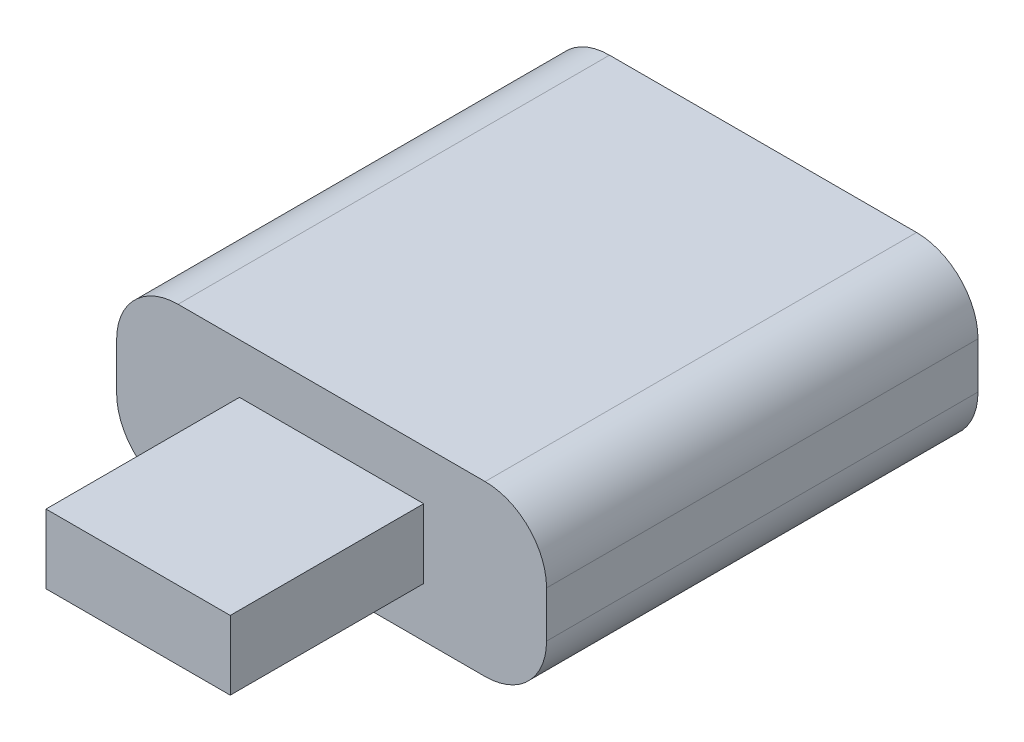
ISO-10303-21;
HEADER;
FILE_DESCRIPTION(('STEP AP214'),'2;1');
FILE_NAME('part.step','',(''),(''),'','','');
FILE_SCHEMA(('AUTOMOTIVE_DESIGN { 1 0 10303 214 1 1 1 1 }'));
ENDSEC;
DATA;
#1=APPLICATION_CONTEXT('core data for automotive mechanical design processes');
#2=APPLICATION_PROTOCOL_DEFINITION('international standard','automotive_design',2000,#1);
#3=PRODUCT_CONTEXT('',#1,'mechanical');
#4=PRODUCT('Part','Part','',(#3));
#5=PRODUCT_RELATED_PRODUCT_CATEGORY('part','',(#4));
#6=PRODUCT_DEFINITION_FORMATION('','',#4);
#7=PRODUCT_DEFINITION_CONTEXT('part definition',#1,'design');
#8=PRODUCT_DEFINITION('design','',#6,#7);
#9=PRODUCT_DEFINITION_SHAPE('','',#8);
#10=(LENGTH_UNIT() NAMED_UNIT(*) SI_UNIT(.MILLI.,.METRE.));
#11=(NAMED_UNIT(*) PLANE_ANGLE_UNIT() SI_UNIT($,.RADIAN.));
#12=(NAMED_UNIT(*) SI_UNIT($,.STERADIAN.) SOLID_ANGLE_UNIT());
#13=UNCERTAINTY_MEASURE_WITH_UNIT(LENGTH_MEASURE(1.E-05),#10,'distance_accuracy_value','');
#14=(GEOMETRIC_REPRESENTATION_CONTEXT(3) GLOBAL_UNCERTAINTY_ASSIGNED_CONTEXT((#13)) GLOBAL_UNIT_ASSIGNED_CONTEXT((#10,
#11,#12)) REPRESENTATION_CONTEXT('',''));
#15=CARTESIAN_POINT('',(0.,0.,0.));
#16=DIRECTION('',(0.,0.,1.));
#17=DIRECTION('',(1.,0.,0.));
#18=AXIS2_PLACEMENT_3D('',#15,#16,#17);
#19=CARTESIAN_POINT('',(0.,-5.5,14.05));
#20=DIRECTION('',(0.,0.,1.));
#21=DIRECTION('',(1.,0.,0.));
#22=AXIS2_PLACEMENT_3D('',#19,#20,#21);
#23=PLANE('',#22);
#24=DIRECTION('',(0.,1.,0.));
#25=VECTOR('',#24,1.);
#26=CARTESIAN_POINT('',(-14.,-5.5,14.05));
#27=LINE('',#26,#25);
#28=CARTESIAN_POINT('',(-14.,-1.5,14.05));
#29=VERTEX_POINT('',#28);
#30=CARTESIAN_POINT('',(-14.,1.5,14.05));
#31=VERTEX_POINT('',#30);
#32=EDGE_CURVE('E185',#29,#31,#27,.T.);
#33=ORIENTED_EDGE('',*,*,#32,.F.);
#34=CARTESIAN_POINT('',(-9.99999999999999,-1.5,14.05));
#35=DIRECTION('',(0.,0.,1.));
#36=DIRECTION('',(1.,0.,0.));
#37=AXIS2_PLACEMENT_3D('',#34,#35,#36);
#38=CIRCLE('',#37,4.);
#39=CARTESIAN_POINT('',(-9.99999999999999,-5.5,14.05));
#40=VERTEX_POINT('',#39);
#41=EDGE_CURVE('E202',#29,#40,#38,.T.);
#42=ORIENTED_EDGE('',*,*,#41,.T.);
#43=DIRECTION('',(1.,0.,0.));
#44=VECTOR('',#43,1.);
#45=CARTESIAN_POINT('',(0.,-5.5,14.05));
#46=LINE('',#45,#44);
#47=CARTESIAN_POINT('',(10.,-5.5,14.05));
#48=VERTEX_POINT('',#47);
#49=EDGE_CURVE('E177',#40,#48,#46,.T.);
#50=ORIENTED_EDGE('',*,*,#49,.T.);
#51=CARTESIAN_POINT('',(10.,-1.5,14.05));
#52=DIRECTION('',(0.,0.,1.));
#53=DIRECTION('',(1.,0.,0.));
#54=AXIS2_PLACEMENT_3D('',#51,#52,#53);
#55=CIRCLE('',#54,4.);
#56=CARTESIAN_POINT('',(14.,-1.5,14.05));
#57=VERTEX_POINT('',#56);
#58=EDGE_CURVE('E198',#48,#57,#55,.T.);
#59=ORIENTED_EDGE('',*,*,#58,.T.);
#60=DIRECTION('',(0.,1.,0.));
#61=VECTOR('',#60,1.);
#62=CARTESIAN_POINT('',(14.,-5.5,14.05));
#63=LINE('',#62,#61);
#64=CARTESIAN_POINT('',(14.,1.5,14.05));
#65=VERTEX_POINT('',#64);
#66=EDGE_CURVE('E181',#57,#65,#63,.T.);
#67=ORIENTED_EDGE('',*,*,#66,.T.);
#68=CARTESIAN_POINT('',(10.,1.5,14.05));
#69=DIRECTION('',(0.,0.,1.));
#70=DIRECTION('',(1.,0.,0.));
#71=AXIS2_PLACEMENT_3D('',#68,#69,#70);
#72=CIRCLE('',#71,4.);
#73=CARTESIAN_POINT('',(10.,5.5,14.05));
#74=VERTEX_POINT('',#73);
#75=EDGE_CURVE('E196',#65,#74,#72,.T.);
#76=ORIENTED_EDGE('',*,*,#75,.T.);
#77=DIRECTION('',(1.,0.,0.));
#78=VECTOR('',#77,1.);
#79=CARTESIAN_POINT('',(0.,5.5,14.05));
#80=LINE('',#79,#78);
#81=CARTESIAN_POINT('',(-9.99999999999999,5.5,14.05));
#82=VERTEX_POINT('',#81);
#83=EDGE_CURVE('E171',#82,#74,#80,.T.);
#84=ORIENTED_EDGE('',*,*,#83,.F.);
#85=CARTESIAN_POINT('',(-9.99999999999999,1.5,14.05));
#86=DIRECTION('',(0.,0.,1.));
#87=DIRECTION('',(1.,0.,0.));
#88=AXIS2_PLACEMENT_3D('',#85,#86,#87);
#89=CIRCLE('',#88,4.);
#90=EDGE_CURVE('E200',#82,#31,#89,.T.);
#91=ORIENTED_EDGE('',*,*,#90,.T.);
#92=EDGE_LOOP('',(#33,#42,#50,#59,#67,#76,#84,#91));
#93=FACE_BOUND('',#92,.T.);
#94=DIRECTION('',(1.,0.,0.));
#95=VECTOR('',#94,1.);
#96=CARTESIAN_POINT('',(0.,-2.25,14.05));
#97=LINE('',#96,#95);
#98=CARTESIAN_POINT('',(-6.,-2.25,14.05));
#99=VERTEX_POINT('',#98);
#100=CARTESIAN_POINT('',(6.,-2.25,14.05));
#101=VERTEX_POINT('',#100);
#102=EDGE_CURVE('E155',#99,#101,#97,.T.);
#103=ORIENTED_EDGE('',*,*,#102,.F.);
#104=DIRECTION('',(0.,1.,0.));
#105=VECTOR('',#104,1.);
#106=CARTESIAN_POINT('',(-6.,-2.25,14.05));
#107=LINE('',#106,#105);
#108=CARTESIAN_POINT('',(-6.,2.25,14.05));
#109=VERTEX_POINT('',#108);
#110=EDGE_CURVE('E141',#99,#109,#107,.T.);
#111=ORIENTED_EDGE('',*,*,#110,.T.);
#112=DIRECTION('',(1.,0.,0.));
#113=VECTOR('',#112,1.);
#114=CARTESIAN_POINT('',(0.,2.25,14.05));
#115=LINE('',#114,#113);
#116=CARTESIAN_POINT('',(6.,2.25,14.05));
#117=VERTEX_POINT('',#116);
#118=EDGE_CURVE('E149',#109,#117,#115,.T.);
#119=ORIENTED_EDGE('',*,*,#118,.T.);
#120=DIRECTION('',(0.,1.,0.));
#121=VECTOR('',#120,1.);
#122=CARTESIAN_POINT('',(6.,-2.25,14.05));
#123=LINE('',#122,#121);
#124=EDGE_CURVE('E164',#101,#117,#123,.T.);
#125=ORIENTED_EDGE('',*,*,#124,.F.);
#126=EDGE_LOOP('',(#103,#111,#119,#125));
#127=FACE_BOUND('',#126,.T.);
#128=ADVANCED_FACE('F39',(#93,#127),#23,.T.);
#129=CARTESIAN_POINT('',(14.,-5.5,0.));
#130=DIRECTION('',(-1.,0.,0.));
#131=DIRECTION('',(0.,0.,1.));
#132=AXIS2_PLACEMENT_3D('',#129,#130,#131);
#133=PLANE('',#132);
#134=ORIENTED_EDGE('',*,*,#66,.F.);
#135=DIRECTION('',(0.,0.,1.));
#136=VECTOR('',#135,1.);
#137=CARTESIAN_POINT('',(14.,-1.5,0.));
#138=LINE('',#137,#136);
#139=CARTESIAN_POINT('',(14.,-1.5,-14.05));
#140=VERTEX_POINT('',#139);
#141=EDGE_CURVE('E11',#57,#140,#138,.F.);
#142=ORIENTED_EDGE('',*,*,#141,.T.);
#143=DIRECTION('',(0.,1.,0.));
#144=VECTOR('',#143,1.);
#145=CARTESIAN_POINT('',(14.,-5.5,-14.05));
#146=LINE('',#145,#144);
#147=CARTESIAN_POINT('',(14.,1.5,-14.05));
#148=VERTEX_POINT('',#147);
#149=EDGE_CURVE('E180',#140,#148,#146,.T.);
#150=ORIENTED_EDGE('',*,*,#149,.T.);
#151=DIRECTION('',(0.,0.,1.));
#152=VECTOR('',#151,1.);
#153=CARTESIAN_POINT('',(14.,1.5,14.05));
#154=LINE('',#153,#152);
#155=EDGE_CURVE('E47',#148,#65,#154,.T.);
#156=ORIENTED_EDGE('',*,*,#155,.T.);
#157=EDGE_LOOP('',(#134,#142,#150,#156));
#158=FACE_BOUND('',#157,.T.);
#159=ADVANCED_FACE('F222',(#158),#133,.F.);
#160=CARTESIAN_POINT('',(-14.,-5.5,0.));
#161=DIRECTION('',(-1.,0.,0.));
#162=DIRECTION('',(0.,0.,1.));
#163=AXIS2_PLACEMENT_3D('',#160,#161,#162);
#164=PLANE('',#163);
#165=DIRECTION('',(0.,1.,0.));
#166=VECTOR('',#165,1.);
#167=CARTESIAN_POINT('',(-14.,-5.5,-14.05));
#168=LINE('',#167,#166);
#169=CARTESIAN_POINT('',(-14.,-1.5,-14.05));
#170=VERTEX_POINT('',#169);
#171=CARTESIAN_POINT('',(-14.,1.5,-14.05));
#172=VERTEX_POINT('',#171);
#173=EDGE_CURVE('E188',#170,#172,#168,.T.);
#174=ORIENTED_EDGE('',*,*,#173,.F.);
#175=DIRECTION('',(0.,0.,1.));
#176=VECTOR('',#175,1.);
#177=CARTESIAN_POINT('',(-14.,-1.5,14.05));
#178=LINE('',#177,#176);
#179=EDGE_CURVE('E193',#170,#29,#178,.T.);
#180=ORIENTED_EDGE('',*,*,#179,.T.);
#181=ORIENTED_EDGE('',*,*,#32,.T.);
#182=DIRECTION('',(0.,0.,1.));
#183=VECTOR('',#182,1.);
#184=CARTESIAN_POINT('',(-14.,1.5,0.));
#185=LINE('',#184,#183);
#186=EDGE_CURVE('E184',#31,#172,#185,.F.);
#187=ORIENTED_EDGE('',*,*,#186,.T.);
#188=EDGE_LOOP('',(#174,#180,#181,#187));
#189=FACE_BOUND('',#188,.T.);
#190=ADVANCED_FACE('F244',(#189),#164,.T.);
#191=CARTESIAN_POINT('',(0.,-5.5,-14.05));
#192=DIRECTION('',(0.,0.,1.));
#193=DIRECTION('',(1.,0.,0.));
#194=AXIS2_PLACEMENT_3D('',#191,#192,#193);
#195=PLANE('',#194);
#196=DIRECTION('',(1.,0.,0.));
#197=VECTOR('',#196,1.);
#198=CARTESIAN_POINT('',(0.,-5.5,-14.05));
#199=LINE('',#198,#197);
#200=CARTESIAN_POINT('',(-10.,-5.5,-14.05));
#201=VERTEX_POINT('',#200);
#202=CARTESIAN_POINT('',(10.,-5.5,-14.05));
#203=VERTEX_POINT('',#202);
#204=EDGE_CURVE('E174',#201,#203,#199,.T.);
#205=ORIENTED_EDGE('',*,*,#204,.F.);
#206=CARTESIAN_POINT('',(-10.,-1.5,-14.05));
#207=DIRECTION('',(0.,0.,1.));
#208=DIRECTION('',(1.,0.,0.));
#209=AXIS2_PLACEMENT_3D('',#206,#207,#208);
#210=CIRCLE('',#209,4.);
#211=EDGE_CURVE('E214',#201,#170,#210,.F.);
#212=ORIENTED_EDGE('',*,*,#211,.T.);
#213=ORIENTED_EDGE('',*,*,#173,.T.);
#214=CARTESIAN_POINT('',(-10.,1.5,-14.05));
#215=DIRECTION('',(0.,0.,1.));
#216=DIRECTION('',(1.,0.,0.));
#217=AXIS2_PLACEMENT_3D('',#214,#215,#216);
#218=CIRCLE('',#217,4.);
#219=CARTESIAN_POINT('',(-10.,5.5,-14.05));
#220=VERTEX_POINT('',#219);
#221=EDGE_CURVE('E212',#172,#220,#218,.F.);
#222=ORIENTED_EDGE('',*,*,#221,.T.);
#223=DIRECTION('',(1.,0.,0.));
#224=VECTOR('',#223,1.);
#225=CARTESIAN_POINT('',(0.,5.5,-14.05));
#226=LINE('',#225,#224);
#227=CARTESIAN_POINT('',(10.,5.5,-14.05));
#228=VERTEX_POINT('',#227);
#229=EDGE_CURVE('E165',#220,#228,#226,.T.);
#230=ORIENTED_EDGE('',*,*,#229,.T.);
#231=CARTESIAN_POINT('',(10.,1.5,-14.05));
#232=DIRECTION('',(0.,0.,1.));
#233=DIRECTION('',(1.,0.,0.));
#234=AXIS2_PLACEMENT_3D('',#231,#232,#233);
#235=CIRCLE('',#234,4.);
#236=EDGE_CURVE('E54',#228,#148,#235,.F.);
#237=ORIENTED_EDGE('',*,*,#236,.T.);
#238=ORIENTED_EDGE('',*,*,#149,.F.);
#239=CARTESIAN_POINT('',(10.,-1.5,-14.05));
#240=DIRECTION('',(0.,0.,1.));
#241=DIRECTION('',(1.,0.,0.));
#242=AXIS2_PLACEMENT_3D('',#239,#240,#241);
#243=CIRCLE('',#242,4.);
#244=EDGE_CURVE('E210',#140,#203,#243,.F.);
#245=ORIENTED_EDGE('',*,*,#244,.T.);
#246=EDGE_LOOP('',(#205,#212,#213,#222,#230,#237,#238,#245));
#247=FACE_BOUND('',#246,.T.);
#248=ADVANCED_FACE('F238',(#247),#195,.F.);
#249=CARTESIAN_POINT('',(0.,-5.5,0.));
#250=DIRECTION('',(0.,1.,0.));
#251=DIRECTION('',(0.,0.,1.));
#252=AXIS2_PLACEMENT_3D('',#249,#250,#251);
#253=PLANE('',#252);
#254=ORIENTED_EDGE('',*,*,#49,.F.);
#255=DIRECTION('',(0.,0.,1.));
#256=VECTOR('',#255,1.);
#257=CARTESIAN_POINT('',(-10.,-5.5,-14.05));
#258=LINE('',#257,#256);
#259=EDGE_CURVE('E207',#40,#201,#258,.F.);
#260=ORIENTED_EDGE('',*,*,#259,.T.);
#261=ORIENTED_EDGE('',*,*,#204,.T.);
#262=DIRECTION('',(0.,0.,1.));
#263=VECTOR('',#262,1.);
#264=CARTESIAN_POINT('',(10.,-5.5,0.));
#265=LINE('',#264,#263);
#266=EDGE_CURVE('E204',#203,#48,#265,.T.);
#267=ORIENTED_EDGE('',*,*,#266,.T.);
#268=EDGE_LOOP('',(#254,#260,#261,#267));
#269=FACE_BOUND('',#268,.T.);
#270=ADVANCED_FACE('F234',(#269),#253,.F.);
#271=CARTESIAN_POINT('',(0.,5.5,0.));
#272=DIRECTION('',(0.,1.,0.));
#273=DIRECTION('',(0.,0.,1.));
#274=AXIS2_PLACEMENT_3D('',#271,#272,#273);
#275=PLANE('',#274);
#276=ORIENTED_EDGE('',*,*,#229,.F.);
#277=DIRECTION('',(0.,0.,1.));
#278=VECTOR('',#277,1.);
#279=CARTESIAN_POINT('',(-10.,5.5,0.));
#280=LINE('',#279,#278);
#281=EDGE_CURVE('E218',#220,#82,#280,.T.);
#282=ORIENTED_EDGE('',*,*,#281,.T.);
#283=ORIENTED_EDGE('',*,*,#83,.T.);
#284=DIRECTION('',(0.,0.,1.));
#285=VECTOR('',#284,1.);
#286=CARTESIAN_POINT('',(10.,5.5,-14.05));
#287=LINE('',#286,#285);
#288=EDGE_CURVE('E216',#74,#228,#287,.F.);
#289=ORIENTED_EDGE('',*,*,#288,.T.);
#290=EDGE_LOOP('',(#276,#282,#283,#289));
#291=FACE_BOUND('',#290,.T.);
#292=ADVANCED_FACE('F252',(#291),#275,.T.);
#293=CARTESIAN_POINT('',(6.,-2.25,0.));
#294=DIRECTION('',(-1.,0.,0.));
#295=DIRECTION('',(0.,0.,1.));
#296=AXIS2_PLACEMENT_3D('',#293,#294,#295);
#297=PLANE('',#296);
#298=ORIENTED_EDGE('',*,*,#124,.T.);
#299=DIRECTION('',(0.,0.,1.));
#300=VECTOR('',#299,1.);
#301=CARTESIAN_POINT('',(6.,2.25,0.));
#302=LINE('',#301,#300);
#303=CARTESIAN_POINT('',(6.,2.25,26.65));
#304=VERTEX_POINT('',#303);
#305=EDGE_CURVE('E410',#117,#304,#302,.T.);
#306=ORIENTED_EDGE('',*,*,#305,.T.);
#307=DIRECTION('',(0.,1.,0.));
#308=VECTOR('',#307,1.);
#309=CARTESIAN_POINT('',(6.,-2.25,26.65));
#310=LINE('',#309,#308);
#311=CARTESIAN_POINT('',(6.,-2.25,26.65));
#312=VERTEX_POINT('',#311);
#313=EDGE_CURVE('E140',#312,#304,#310,.T.);
#314=ORIENTED_EDGE('',*,*,#313,.F.);
#315=DIRECTION('',(0.,0.,1.));
#316=VECTOR('',#315,1.);
#317=CARTESIAN_POINT('',(6.,-2.25,0.));
#318=LINE('',#317,#316);
#319=EDGE_CURVE('E153',#101,#312,#318,.T.);
#320=ORIENTED_EDGE('',*,*,#319,.F.);
#321=EDGE_LOOP('',(#298,#306,#314,#320));
#322=FACE_BOUND('',#321,.T.);
#323=ADVANCED_FACE('F334',(#322),#297,.F.);
#324=CARTESIAN_POINT('',(0.,-2.25,26.65));
#325=DIRECTION('',(0.,0.,1.));
#326=DIRECTION('',(1.,0.,0.));
#327=AXIS2_PLACEMENT_3D('',#324,#325,#326);
#328=PLANE('',#327);
#329=ORIENTED_EDGE('',*,*,#313,.T.);
#330=DIRECTION('',(1.,0.,0.));
#331=VECTOR('',#330,1.);
#332=CARTESIAN_POINT('',(0.,2.25,26.65));
#333=LINE('',#332,#331);
#334=CARTESIAN_POINT('',(-6.,2.25,26.65));
#335=VERTEX_POINT('',#334);
#336=EDGE_CURVE('E147',#335,#304,#333,.T.);
#337=ORIENTED_EDGE('',*,*,#336,.F.);
#338=DIRECTION('',(0.,1.,0.));
#339=VECTOR('',#338,1.);
#340=CARTESIAN_POINT('',(-6.,-2.25,26.65));
#341=LINE('',#340,#339);
#342=CARTESIAN_POINT('',(-6.,-2.25,26.65));
#343=VERTEX_POINT('',#342);
#344=EDGE_CURVE('E128',#343,#335,#341,.T.);
#345=ORIENTED_EDGE('',*,*,#344,.F.);
#346=DIRECTION('',(1.,0.,0.));
#347=VECTOR('',#346,1.);
#348=CARTESIAN_POINT('',(0.,-2.25,26.65));
#349=LINE('',#348,#347);
#350=EDGE_CURVE('E162',#343,#312,#349,.T.);
#351=ORIENTED_EDGE('',*,*,#350,.T.);
#352=EDGE_LOOP('',(#329,#337,#345,#351));
#353=FACE_BOUND('',#352,.T.);
#354=ADVANCED_FACE('F151',(#353),#328,.T.);
#355=CARTESIAN_POINT('',(-6.,-2.25,0.));
#356=DIRECTION('',(-1.,0.,0.));
#357=DIRECTION('',(0.,0.,1.));
#358=AXIS2_PLACEMENT_3D('',#355,#356,#357);
#359=PLANE('',#358);
#360=ORIENTED_EDGE('',*,*,#344,.T.);
#361=DIRECTION('',(0.,0.,1.));
#362=VECTOR('',#361,1.);
#363=CARTESIAN_POINT('',(-6.,2.25,0.));
#364=LINE('',#363,#362);
#365=EDGE_CURVE('E132',#109,#335,#364,.T.);
#366=ORIENTED_EDGE('',*,*,#365,.F.);
#367=ORIENTED_EDGE('',*,*,#110,.F.);
#368=DIRECTION('',(0.,0.,1.));
#369=VECTOR('',#368,1.);
#370=CARTESIAN_POINT('',(-6.,-2.25,0.));
#371=LINE('',#370,#369);
#372=EDGE_CURVE('E135',#99,#343,#371,.T.);
#373=ORIENTED_EDGE('',*,*,#372,.T.);
#374=EDGE_LOOP('',(#360,#366,#367,#373));
#375=FACE_BOUND('',#374,.T.);
#376=ADVANCED_FACE('F130',(#375),#359,.T.);
#377=CARTESIAN_POINT('',(0.,-2.25,0.));
#378=DIRECTION('',(0.,1.,0.));
#379=DIRECTION('',(0.,0.,1.));
#380=AXIS2_PLACEMENT_3D('',#377,#378,#379);
#381=PLANE('',#380);
#382=ORIENTED_EDGE('',*,*,#319,.T.);
#383=ORIENTED_EDGE('',*,*,#350,.F.);
#384=ORIENTED_EDGE('',*,*,#372,.F.);
#385=ORIENTED_EDGE('',*,*,#102,.T.);
#386=EDGE_LOOP('',(#382,#383,#384,#385));
#387=FACE_BOUND('',#386,.T.);
#388=ADVANCED_FACE('F308',(#387),#381,.F.);
#389=CARTESIAN_POINT('',(0.,2.25,0.));
#390=DIRECTION('',(0.,1.,0.));
#391=DIRECTION('',(0.,0.,1.));
#392=AXIS2_PLACEMENT_3D('',#389,#390,#391);
#393=PLANE('',#392);
#394=ORIENTED_EDGE('',*,*,#305,.F.);
#395=ORIENTED_EDGE('',*,*,#118,.F.);
#396=ORIENTED_EDGE('',*,*,#365,.T.);
#397=ORIENTED_EDGE('',*,*,#336,.T.);
#398=EDGE_LOOP('',(#394,#395,#396,#397));
#399=FACE_BOUND('',#398,.T.);
#400=ADVANCED_FACE('F146',(#399),#393,.T.);
#401=CARTESIAN_POINT('',(-10.,-1.5,0.));
#402=DIRECTION('',(0.,0.,-1.));
#403=DIRECTION('',(-1.,0.,0.));
#404=AXIS2_PLACEMENT_3D('',#401,#402,#403);
#405=CYLINDRICAL_SURFACE('',#404,4.);
#406=ORIENTED_EDGE('',*,*,#211,.F.);
#407=ORIENTED_EDGE('',*,*,#259,.F.);
#408=ORIENTED_EDGE('',*,*,#41,.F.);
#409=ORIENTED_EDGE('',*,*,#179,.F.);
#410=EDGE_LOOP('',(#406,#407,#408,#409));
#411=FACE_BOUND('',#410,.T.);
#412=ADVANCED_FACE('F242',(#411),#405,.T.);
#413=CARTESIAN_POINT('',(-10.,1.5,0.));
#414=DIRECTION('',(0.,0.,1.));
#415=DIRECTION('',(1.,0.,0.));
#416=AXIS2_PLACEMENT_3D('',#413,#414,#415);
#417=CYLINDRICAL_SURFACE('',#416,4.);
#418=ORIENTED_EDGE('',*,*,#221,.F.);
#419=ORIENTED_EDGE('',*,*,#186,.F.);
#420=ORIENTED_EDGE('',*,*,#90,.F.);
#421=ORIENTED_EDGE('',*,*,#281,.F.);
#422=EDGE_LOOP('',(#418,#419,#420,#421));
#423=FACE_BOUND('',#422,.T.);
#424=ADVANCED_FACE('F249',(#423),#417,.T.);
#425=CARTESIAN_POINT('',(10.,-1.5,0.));
#426=DIRECTION('',(0.,0.,1.));
#427=DIRECTION('',(1.,0.,0.));
#428=AXIS2_PLACEMENT_3D('',#425,#426,#427);
#429=CYLINDRICAL_SURFACE('',#428,4.);
#430=ORIENTED_EDGE('',*,*,#244,.F.);
#431=ORIENTED_EDGE('',*,*,#141,.F.);
#432=ORIENTED_EDGE('',*,*,#58,.F.);
#433=ORIENTED_EDGE('',*,*,#266,.F.);
#434=EDGE_LOOP('',(#430,#431,#432,#433));
#435=FACE_BOUND('',#434,.T.);
#436=ADVANCED_FACE('F232',(#435),#429,.T.);
#437=CARTESIAN_POINT('',(10.,1.5,0.));
#438=DIRECTION('',(0.,0.,-1.));
#439=DIRECTION('',(-1.,0.,0.));
#440=AXIS2_PLACEMENT_3D('',#437,#438,#439);
#441=CYLINDRICAL_SURFACE('',#440,4.);
#442=ORIENTED_EDGE('',*,*,#236,.F.);
#443=ORIENTED_EDGE('',*,*,#288,.F.);
#444=ORIENTED_EDGE('',*,*,#75,.F.);
#445=ORIENTED_EDGE('',*,*,#155,.F.);
#446=EDGE_LOOP('',(#442,#443,#444,#445));
#447=FACE_BOUND('',#446,.T.);
#448=ADVANCED_FACE('F41',(#447),#441,.T.);
#449=CLOSED_SHELL('',(#128,#159,#190,#248,#270,#292,#323,#354,#376,#388,#400,#412,#424,#436,#448));
#450=MANIFOLD_SOLID_BREP('B2',#449);
#451=ADVANCED_BREP_SHAPE_REPRESENTATION('',(#18,#450),#14);
#452=SHAPE_DEFINITION_REPRESENTATION(#9,#451);
ENDSEC;
END-ISO-10303-21;
